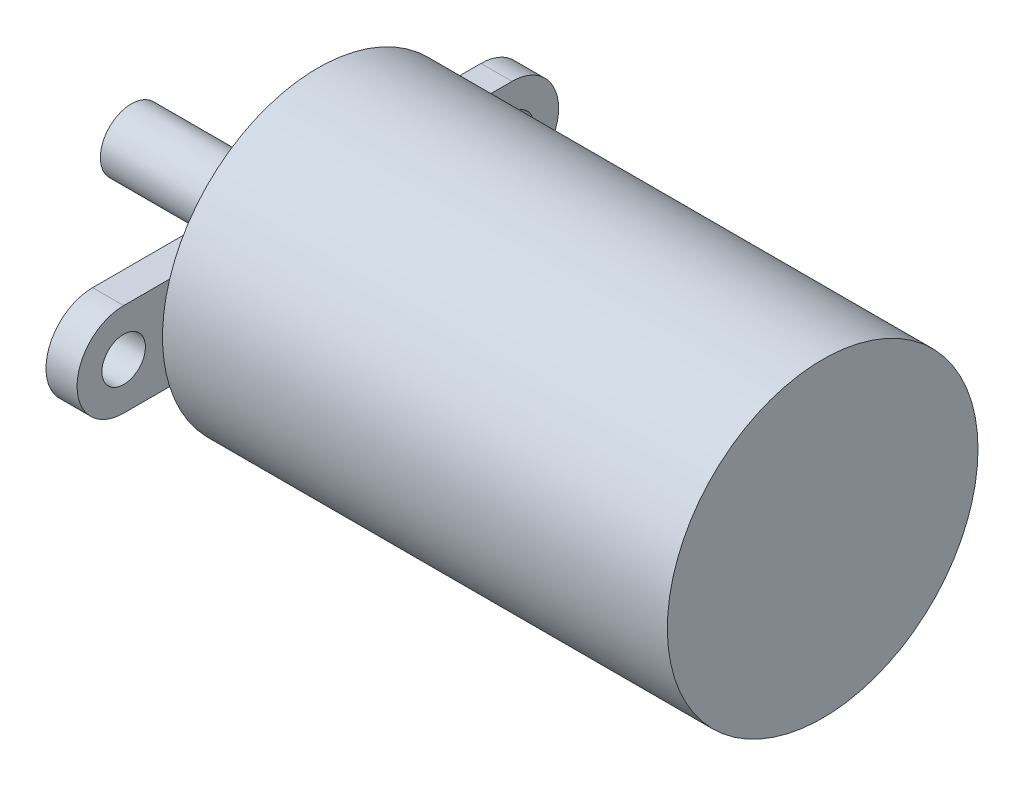
ISO-10303-21;
HEADER;
FILE_DESCRIPTION(('STEP AP214'),'2;1');
FILE_NAME('part.step','',(''),(''),'','','');
FILE_SCHEMA(('AUTOMOTIVE_DESIGN { 1 0 10303 214 1 1 1 1 }'));
ENDSEC;
DATA;
#1=APPLICATION_CONTEXT('core data for automotive mechanical design processes');
#2=APPLICATION_PROTOCOL_DEFINITION('international standard','automotive_design',2000,#1);
#3=PRODUCT_CONTEXT('',#1,'mechanical');
#4=PRODUCT('Part','Part','',(#3));
#5=PRODUCT_RELATED_PRODUCT_CATEGORY('part','',(#4));
#6=PRODUCT_DEFINITION_FORMATION('','',#4);
#7=PRODUCT_DEFINITION_CONTEXT('part definition',#1,'design');
#8=PRODUCT_DEFINITION('design','',#6,#7);
#9=PRODUCT_DEFINITION_SHAPE('','',#8);
#10=(LENGTH_UNIT() NAMED_UNIT(*) SI_UNIT(.MILLI.,.METRE.));
#11=(NAMED_UNIT(*) PLANE_ANGLE_UNIT() SI_UNIT($,.RADIAN.));
#12=(NAMED_UNIT(*) SI_UNIT($,.STERADIAN.) SOLID_ANGLE_UNIT());
#13=UNCERTAINTY_MEASURE_WITH_UNIT(LENGTH_MEASURE(1.E-05),#10,'distance_accuracy_value','');
#14=(GEOMETRIC_REPRESENTATION_CONTEXT(3) GLOBAL_UNCERTAINTY_ASSIGNED_CONTEXT((#13)) GLOBAL_UNIT_ASSIGNED_CONTEXT((#10,
#11,#12)) REPRESENTATION_CONTEXT('',''));
#15=CARTESIAN_POINT('',(0.,0.,0.));
#16=DIRECTION('',(0.,0.,1.));
#17=DIRECTION('',(1.,0.,0.));
#18=AXIS2_PLACEMENT_3D('',#15,#16,#17);
#19=CARTESIAN_POINT('',(-4.,0.,0.));
#20=DIRECTION('',(-1.,0.,0.));
#21=DIRECTION('',(0.,0.,1.));
#22=AXIS2_PLACEMENT_3D('',#19,#20,#21);
#23=PLANE('',#22);
#24=CARTESIAN_POINT('',(-4.,0.,0.));
#25=DIRECTION('',(-1.,0.,0.));
#26=DIRECTION('',(0.,0.,1.));
#27=AXIS2_PLACEMENT_3D('',#24,#25,#26);
#28=CIRCLE('',#27,4.);
#29=CARTESIAN_POINT('',(-4.,0.,4.));
#30=VERTEX_POINT('',#29);
#31=EDGE_CURVE('E124',#30,#30,#28,.T.);
#32=ORIENTED_EDGE('',*,*,#31,.T.);
#33=EDGE_LOOP('',(#32));
#34=FACE_BOUND('',#33,.T.);
#35=CARTESIAN_POINT('',(-4.,0.,0.));
#36=DIRECTION('',(-1.,0.,0.));
#37=DIRECTION('',(0.,0.,1.));
#38=AXIS2_PLACEMENT_3D('',#35,#36,#37);
#39=CIRCLE('',#38,2.);
#40=CARTESIAN_POINT('',(-4.,0.,2.));
#41=VERTEX_POINT('',#40);
#42=EDGE_CURVE('E377',#41,#41,#39,.T.);
#43=ORIENTED_EDGE('',*,*,#42,.F.);
#44=EDGE_LOOP('',(#43));
#45=FACE_BOUND('',#44,.T.);
#46=ADVANCED_FACE('F33',(#34,#45),#23,.T.);
#47=CARTESIAN_POINT('',(-2.,0.,-12.5));
#48=DIRECTION('',(-1.,0.,0.));
#49=DIRECTION('',(0.,0.,1.));
#50=AXIS2_PLACEMENT_3D('',#47,#48,#49);
#51=PLANE('',#50);
#52=CARTESIAN_POINT('',(-2.,0.,0.));
#53=DIRECTION('',(-1.,0.,0.));
#54=DIRECTION('',(0.,0.,1.));
#55=AXIS2_PLACEMENT_3D('',#52,#53,#54);
#56=CIRCLE('',#55,4.);
#57=CARTESIAN_POINT('',(-2.,3.00000000000001,-2.64575131106458));
#58=VERTEX_POINT('',#57);
#59=CARTESIAN_POINT('',(-2.,-3.,-2.64575131106459));
#60=VERTEX_POINT('',#59);
#61=EDGE_CURVE('E11',#58,#60,#56,.T.);
#62=ORIENTED_EDGE('',*,*,#61,.F.);
#63=DIRECTION('',(0.,0.,-1.));
#64=VECTOR('',#63,1.);
#65=CARTESIAN_POINT('',(-2.,3.00000000000001,-12.5));
#66=LINE('',#65,#64);
#67=CARTESIAN_POINT('',(-2.,3.00000000000001,-12.5));
#68=VERTEX_POINT('',#67);
#69=EDGE_CURVE('E109',#58,#68,#66,.T.);
#70=ORIENTED_EDGE('',*,*,#69,.T.);
#71=CARTESIAN_POINT('',(-2.,0.,-12.5));
#72=DIRECTION('',(-1.,0.,0.));
#73=DIRECTION('',(0.,0.,1.));
#74=AXIS2_PLACEMENT_3D('',#71,#72,#73);
#75=CIRCLE('',#74,3.00000000000001);
#76=CARTESIAN_POINT('',(-2.,-3.00000000000001,-12.5));
#77=VERTEX_POINT('',#76);
#78=EDGE_CURVE('E140',#68,#77,#75,.T.);
#79=ORIENTED_EDGE('',*,*,#78,.T.);
#80=DIRECTION('',(0.,0.,1.));
#81=VECTOR('',#80,1.);
#82=CARTESIAN_POINT('',(-2.,-3.00000000000001,-12.5));
#83=LINE('',#82,#81);
#84=EDGE_CURVE('E145',#77,#60,#83,.T.);
#85=ORIENTED_EDGE('',*,*,#84,.T.);
#86=EDGE_LOOP('',(#62,#70,#79,#85));
#87=FACE_BOUND('',#86,.T.);
#88=CARTESIAN_POINT('',(-2.,-0.140336266117075,-12.5));
#89=DIRECTION('',(-1.,0.,0.));
#90=DIRECTION('',(0.,0.,1.));
#91=AXIS2_PLACEMENT_3D('',#88,#89,#90);
#92=CIRCLE('',#91,1.39999999999999);
#93=CARTESIAN_POINT('',(-2.,-0.140336266117075,-11.1));
#94=VERTEX_POINT('',#93);
#95=EDGE_CURVE('E126',#94,#94,#92,.T.);
#96=ORIENTED_EDGE('',*,*,#95,.F.);
#97=EDGE_LOOP('',(#96));
#98=FACE_BOUND('',#97,.T.);
#99=ADVANCED_FACE('F221',(#87,#98),#51,.T.);
#100=CARTESIAN_POINT('',(0.,0.,0.));
#101=DIRECTION('',(1.,0.,0.));
#102=DIRECTION('',(0.,0.,-1.));
#103=AXIS2_PLACEMENT_3D('',#100,#101,#102);
#104=PLANE('',#103);
#105=DIRECTION('',(0.,0.,-1.));
#106=VECTOR('',#105,1.);
#107=CARTESIAN_POINT('',(0.,3.00000000000001,-12.5));
#108=LINE('',#107,#106);
#109=CARTESIAN_POINT('',(0.,3.00000000000001,9.53939201416946));
#110=VERTEX_POINT('',#109);
#111=CARTESIAN_POINT('',(0.,3.00000000000001,-9.53939201416946));
#112=VERTEX_POINT('',#111);
#113=EDGE_CURVE('E122',#110,#112,#108,.T.);
#114=ORIENTED_EDGE('',*,*,#113,.F.);
#115=CARTESIAN_POINT('',(0.,0.,0.));
#116=DIRECTION('',(1.,0.,0.));
#117=DIRECTION('',(0.,0.,-1.));
#118=AXIS2_PLACEMENT_3D('',#115,#116,#117);
#119=CIRCLE('',#118,10.);
#120=EDGE_CURVE('E173',#112,#110,#119,.T.);
#121=ORIENTED_EDGE('',*,*,#120,.F.);
#122=EDGE_LOOP('',(#114,#121));
#123=FACE_BOUND('',#122,.T.);
#124=ADVANCED_FACE('F227',(#123),#104,.F.);
#125=DIRECTION('',(0.,0.,1.));
#126=VECTOR('',#125,1.);
#127=CARTESIAN_POINT('',(0.,-3.00000000000001,-12.5));
#128=LINE('',#127,#126);
#129=CARTESIAN_POINT('',(0.,-3.,-9.53939201416946));
#130=VERTEX_POINT('',#129);
#131=CARTESIAN_POINT('',(0.,-3.,9.53939201416946));
#132=VERTEX_POINT('',#131);
#133=EDGE_CURVE('E156',#130,#132,#128,.T.);
#134=ORIENTED_EDGE('',*,*,#133,.F.);
#135=EDGE_CURVE('E179',#132,#130,#119,.T.);
#136=ORIENTED_EDGE('',*,*,#135,.F.);
#137=EDGE_LOOP('',(#134,#136));
#138=FACE_BOUND('',#137,.T.);
#139=ADVANCED_FACE('F257',(#138),#104,.F.);
#140=CARTESIAN_POINT('',(32.5,0.,0.));
#141=DIRECTION('',(-1.,0.,0.));
#142=DIRECTION('',(0.,0.,1.));
#143=AXIS2_PLACEMENT_3D('',#140,#141,#142);
#144=CYLINDRICAL_SURFACE('',#143,10.);
#145=CARTESIAN_POINT('',(32.5,0.,0.));
#146=DIRECTION('',(1.,0.,0.));
#147=DIRECTION('',(0.,0.,-1.));
#148=AXIS2_PLACEMENT_3D('',#145,#146,#147);
#149=CIRCLE('',#148,10.);
#150=CARTESIAN_POINT('',(32.5,0.,-10.));
#151=VERTEX_POINT('',#150);
#152=EDGE_CURVE('E171',#151,#151,#149,.T.);
#153=ORIENTED_EDGE('',*,*,#152,.F.);
#154=EDGE_LOOP('',(#153));
#155=FACE_BOUND('',#154,.T.);
#156=ORIENTED_EDGE('',*,*,#120,.T.);
#157=EDGE_CURVE('E175',#110,#132,#119,.T.);
#158=ORIENTED_EDGE('',*,*,#157,.T.);
#159=ORIENTED_EDGE('',*,*,#135,.T.);
#160=EDGE_CURVE('E170',#130,#112,#119,.T.);
#161=ORIENTED_EDGE('',*,*,#160,.T.);
#162=EDGE_LOOP('',(#156,#158,#159,#161));
#163=FACE_BOUND('',#162,.T.);
#164=ADVANCED_FACE('F35',(#155,#163),#144,.T.);
#165=CARTESIAN_POINT('',(32.5,0.,0.));
#166=DIRECTION('',(1.,0.,0.));
#167=DIRECTION('',(0.,0.,-1.));
#168=AXIS2_PLACEMENT_3D('',#165,#166,#167);
#169=PLANE('',#168);
#170=ORIENTED_EDGE('',*,*,#152,.T.);
#171=EDGE_LOOP('',(#170));
#172=FACE_BOUND('',#171,.T.);
#173=ADVANCED_FACE('F205',(#172),#169,.T.);
#174=CARTESIAN_POINT('',(0.,0.,-12.5));
#175=DIRECTION('',(-1.,0.,0.));
#176=DIRECTION('',(0.,0.,1.));
#177=AXIS2_PLACEMENT_3D('',#174,#175,#176);
#178=PLANE('',#177);
#179=CARTESIAN_POINT('',(0.,0.,12.5));
#180=DIRECTION('',(-1.,0.,0.));
#181=DIRECTION('',(0.,0.,1.));
#182=AXIS2_PLACEMENT_3D('',#179,#180,#181);
#183=CIRCLE('',#182,1.39999999999999);
#184=CARTESIAN_POINT('',(0.,0.,13.9));
#185=VERTEX_POINT('',#184);
#186=EDGE_CURVE('E136',#185,#185,#183,.T.);
#187=ORIENTED_EDGE('',*,*,#186,.T.);
#188=EDGE_LOOP('',(#187));
#189=FACE_BOUND('',#188,.T.);
#190=ORIENTED_EDGE('',*,*,#157,.F.);
#191=CARTESIAN_POINT('',(0.,3.00000000000001,12.5));
#192=VERTEX_POINT('',#191);
#193=EDGE_CURVE('E144',#192,#110,#108,.T.);
#194=ORIENTED_EDGE('',*,*,#193,.F.);
#195=CARTESIAN_POINT('',(0.,0.,12.5));
#196=DIRECTION('',(-1.,0.,0.));
#197=DIRECTION('',(0.,0.,1.));
#198=AXIS2_PLACEMENT_3D('',#195,#196,#197);
#199=CIRCLE('',#198,3.00000000000001);
#200=CARTESIAN_POINT('',(0.,-3.,12.5));
#201=VERTEX_POINT('',#200);
#202=EDGE_CURVE('E155',#201,#192,#199,.T.);
#203=ORIENTED_EDGE('',*,*,#202,.F.);
#204=EDGE_CURVE('E151',#132,#201,#128,.T.);
#205=ORIENTED_EDGE('',*,*,#204,.F.);
#206=EDGE_LOOP('',(#190,#194,#203,#205));
#207=FACE_BOUND('',#206,.T.);
#208=ADVANCED_FACE('F203',(#189,#207),#178,.F.);
#209=CARTESIAN_POINT('',(-2.,0.,-12.5));
#210=DIRECTION('',(1.,0.,0.));
#211=DIRECTION('',(0.,0.,-1.));
#212=AXIS2_PLACEMENT_3D('',#209,#210,#211);
#213=CYLINDRICAL_SURFACE('',#212,3.00000000000001);
#214=CARTESIAN_POINT('',(0.,0.,-12.5));
#215=DIRECTION('',(-1.,0.,0.));
#216=DIRECTION('',(0.,0.,1.));
#217=AXIS2_PLACEMENT_3D('',#214,#215,#216);
#218=CIRCLE('',#217,3.00000000000001);
#219=CARTESIAN_POINT('',(0.,3.00000000000001,-12.5));
#220=VERTEX_POINT('',#219);
#221=CARTESIAN_POINT('',(0.,-3.00000000000001,-12.5));
#222=VERTEX_POINT('',#221);
#223=EDGE_CURVE('E139',#220,#222,#218,.T.);
#224=ORIENTED_EDGE('',*,*,#223,.T.);
#225=DIRECTION('',(1.,0.,0.));
#226=VECTOR('',#225,1.);
#227=CARTESIAN_POINT('',(-2.,-3.00000000000001,-12.5));
#228=LINE('',#227,#226);
#229=EDGE_CURVE('E167',#77,#222,#228,.T.);
#230=ORIENTED_EDGE('',*,*,#229,.F.);
#231=ORIENTED_EDGE('',*,*,#78,.F.);
#232=DIRECTION('',(1.,0.,0.));
#233=VECTOR('',#232,1.);
#234=CARTESIAN_POINT('',(-2.,3.00000000000001,-12.5));
#235=LINE('',#234,#233);
#236=EDGE_CURVE('E106',#68,#220,#235,.T.);
#237=ORIENTED_EDGE('',*,*,#236,.T.);
#238=EDGE_LOOP('',(#224,#230,#231,#237));
#239=FACE_BOUND('',#238,.T.);
#240=ADVANCED_FACE('F196',(#239),#213,.T.);
#241=CARTESIAN_POINT('',(-2.,-3.00000000000001,-12.5));
#242=DIRECTION('',(0.,1.,0.));
#243=DIRECTION('',(0.,0.,1.));
#244=AXIS2_PLACEMENT_3D('',#241,#242,#243);
#245=PLANE('',#244);
#246=EDGE_CURVE('E152',#222,#130,#128,.T.);
#247=ORIENTED_EDGE('',*,*,#246,.T.);
#248=ORIENTED_EDGE('',*,*,#133,.T.);
#249=ORIENTED_EDGE('',*,*,#204,.T.);
#250=DIRECTION('',(1.,0.,0.));
#251=VECTOR('',#250,1.);
#252=CARTESIAN_POINT('',(-2.,-3.,12.5));
#253=LINE('',#252,#251);
#254=CARTESIAN_POINT('',(-2.,-3.,12.5));
#255=VERTEX_POINT('',#254);
#256=EDGE_CURVE('E164',#255,#201,#253,.T.);
#257=ORIENTED_EDGE('',*,*,#256,.F.);
#258=CARTESIAN_POINT('',(-2.,-3.,2.64575131106459));
#259=VERTEX_POINT('',#258);
#260=EDGE_CURVE('E143',#259,#255,#83,.T.);
#261=ORIENTED_EDGE('',*,*,#260,.F.);
#262=EDGE_CURVE('E147',#60,#259,#83,.T.);
#263=ORIENTED_EDGE('',*,*,#262,.F.);
#264=ORIENTED_EDGE('',*,*,#84,.F.);
#265=ORIENTED_EDGE('',*,*,#229,.T.);
#266=EDGE_LOOP('',(#247,#248,#249,#257,#261,#263,#264,#265));
#267=FACE_BOUND('',#266,.T.);
#268=ADVANCED_FACE('F192',(#267),#245,.F.);
#269=CARTESIAN_POINT('',(-2.,0.,12.5));
#270=DIRECTION('',(1.,0.,0.));
#271=DIRECTION('',(0.,0.,-1.));
#272=AXIS2_PLACEMENT_3D('',#269,#270,#271);
#273=CYLINDRICAL_SURFACE('',#272,3.00000000000001);
#274=ORIENTED_EDGE('',*,*,#202,.T.);
#275=DIRECTION('',(1.,0.,0.));
#276=VECTOR('',#275,1.);
#277=CARTESIAN_POINT('',(-2.,3.00000000000001,12.5));
#278=LINE('',#277,#276);
#279=CARTESIAN_POINT('',(-2.,3.00000000000001,12.5));
#280=VERTEX_POINT('',#279);
#281=EDGE_CURVE('E162',#280,#192,#278,.T.);
#282=ORIENTED_EDGE('',*,*,#281,.F.);
#283=CARTESIAN_POINT('',(-2.,0.,12.5));
#284=DIRECTION('',(-1.,0.,0.));
#285=DIRECTION('',(0.,0.,1.));
#286=AXIS2_PLACEMENT_3D('',#283,#284,#285);
#287=CIRCLE('',#286,3.00000000000001);
#288=EDGE_CURVE('E102',#255,#280,#287,.T.);
#289=ORIENTED_EDGE('',*,*,#288,.F.);
#290=ORIENTED_EDGE('',*,*,#256,.T.);
#291=EDGE_LOOP('',(#274,#282,#289,#290));
#292=FACE_BOUND('',#291,.T.);
#293=ADVANCED_FACE('F201',(#292),#273,.T.);
#294=CARTESIAN_POINT('',(-2.,3.00000000000001,-12.5));
#295=DIRECTION('',(0.,-1.,0.));
#296=DIRECTION('',(0.,0.,-1.));
#297=AXIS2_PLACEMENT_3D('',#294,#295,#296);
#298=PLANE('',#297);
#299=ORIENTED_EDGE('',*,*,#193,.T.);
#300=ORIENTED_EDGE('',*,*,#113,.T.);
#301=EDGE_CURVE('E158',#112,#220,#108,.T.);
#302=ORIENTED_EDGE('',*,*,#301,.T.);
#303=ORIENTED_EDGE('',*,*,#236,.F.);
#304=ORIENTED_EDGE('',*,*,#69,.F.);
#305=CARTESIAN_POINT('',(-2.,3.00000000000001,2.64575131106458));
#306=VERTEX_POINT('',#305);
#307=EDGE_CURVE('E107',#306,#58,#66,.T.);
#308=ORIENTED_EDGE('',*,*,#307,.F.);
#309=EDGE_CURVE('E97',#280,#306,#66,.T.);
#310=ORIENTED_EDGE('',*,*,#309,.F.);
#311=ORIENTED_EDGE('',*,*,#281,.T.);
#312=EDGE_LOOP('',(#299,#300,#302,#303,#304,#308,#310,#311));
#313=FACE_BOUND('',#312,.T.);
#314=ADVANCED_FACE('F112',(#313),#298,.F.);
#315=EDGE_CURVE('E42',#259,#306,#56,.T.);
#316=ORIENTED_EDGE('',*,*,#315,.F.);
#317=ORIENTED_EDGE('',*,*,#260,.T.);
#318=ORIENTED_EDGE('',*,*,#288,.T.);
#319=ORIENTED_EDGE('',*,*,#309,.T.);
#320=EDGE_LOOP('',(#316,#317,#318,#319));
#321=FACE_BOUND('',#320,.T.);
#322=CARTESIAN_POINT('',(-2.,0.,12.5));
#323=DIRECTION('',(-1.,0.,0.));
#324=DIRECTION('',(0.,0.,1.));
#325=AXIS2_PLACEMENT_3D('',#322,#323,#324);
#326=CIRCLE('',#325,1.39999999999999);
#327=CARTESIAN_POINT('',(-2.,0.,13.9));
#328=VERTEX_POINT('',#327);
#329=EDGE_CURVE('E133',#328,#328,#326,.T.);
#330=ORIENTED_EDGE('',*,*,#329,.F.);
#331=EDGE_LOOP('',(#330));
#332=FACE_BOUND('',#331,.T.);
#333=ADVANCED_FACE('F99',(#321,#332),#51,.T.);
#334=CARTESIAN_POINT('',(0.,-0.140336266117075,-12.5));
#335=DIRECTION('',(-1.,0.,0.));
#336=DIRECTION('',(0.,0.,1.));
#337=AXIS2_PLACEMENT_3D('',#334,#335,#336);
#338=CIRCLE('',#337,1.39999999999999);
#339=CARTESIAN_POINT('',(0.,-0.140336266117075,-11.1));
#340=VERTEX_POINT('',#339);
#341=EDGE_CURVE('E37',#340,#340,#338,.T.);
#342=ORIENTED_EDGE('',*,*,#341,.T.);
#343=EDGE_LOOP('',(#342));
#344=FACE_BOUND('',#343,.T.);
#345=ORIENTED_EDGE('',*,*,#160,.F.);
#346=ORIENTED_EDGE('',*,*,#246,.F.);
#347=ORIENTED_EDGE('',*,*,#223,.F.);
#348=ORIENTED_EDGE('',*,*,#301,.F.);
#349=EDGE_LOOP('',(#345,#346,#347,#348));
#350=FACE_BOUND('',#349,.T.);
#351=ADVANCED_FACE('F187',(#344,#350),#178,.F.);
#352=CARTESIAN_POINT('',(-2.,0.,12.5));
#353=DIRECTION('',(-1.,0.,0.));
#354=DIRECTION('',(0.,0.,1.));
#355=AXIS2_PLACEMENT_3D('',#352,#353,#354);
#356=CYLINDRICAL_SURFACE('',#355,1.39999999999999);
#357=ORIENTED_EDGE('',*,*,#329,.T.);
#358=EDGE_LOOP('',(#357));
#359=FACE_BOUND('',#358,.T.);
#360=ORIENTED_EDGE('',*,*,#186,.F.);
#361=EDGE_LOOP('',(#360));
#362=FACE_BOUND('',#361,.T.);
#363=ADVANCED_FACE('F218',(#359,#362),#356,.F.);
#364=CARTESIAN_POINT('',(-2.,-0.140336266117075,-12.5));
#365=DIRECTION('',(-1.,0.,0.));
#366=DIRECTION('',(0.,0.,1.));
#367=AXIS2_PLACEMENT_3D('',#364,#365,#366);
#368=CYLINDRICAL_SURFACE('',#367,1.39999999999999);
#369=ORIENTED_EDGE('',*,*,#95,.T.);
#370=EDGE_LOOP('',(#369));
#371=FACE_BOUND('',#370,.T.);
#372=ORIENTED_EDGE('',*,*,#341,.F.);
#373=EDGE_LOOP('',(#372));
#374=FACE_BOUND('',#373,.T.);
#375=ADVANCED_FACE('F236',(#371,#374),#368,.F.);
#376=CARTESIAN_POINT('',(-2.,0.,0.));
#377=DIRECTION('',(-1.,0.,0.));
#378=DIRECTION('',(0.,0.,1.));
#379=AXIS2_PLACEMENT_3D('',#376,#377,#378);
#380=PLANE('',#379);
#381=EDGE_CURVE('E44',#60,#259,#56,.T.);
#382=ORIENTED_EDGE('',*,*,#381,.F.);
#383=ORIENTED_EDGE('',*,*,#262,.T.);
#384=EDGE_LOOP('',(#382,#383));
#385=FACE_BOUND('',#384,.T.);
#386=ADVANCED_FACE('F233',(#385),#380,.F.);
#387=EDGE_CURVE('E120',#306,#58,#56,.T.);
#388=ORIENTED_EDGE('',*,*,#387,.F.);
#389=ORIENTED_EDGE('',*,*,#307,.T.);
#390=EDGE_LOOP('',(#388,#389));
#391=FACE_BOUND('',#390,.T.);
#392=ADVANCED_FACE('F123',(#391),#380,.F.);
#393=CARTESIAN_POINT('',(-4.,0.,0.));
#394=DIRECTION('',(1.,0.,0.));
#395=DIRECTION('',(0.,0.,-1.));
#396=AXIS2_PLACEMENT_3D('',#393,#394,#395);
#397=CYLINDRICAL_SURFACE('',#396,4.);
#398=ORIENTED_EDGE('',*,*,#31,.F.);
#399=EDGE_LOOP('',(#398));
#400=FACE_BOUND('',#399,.T.);
#401=ORIENTED_EDGE('',*,*,#387,.T.);
#402=ORIENTED_EDGE('',*,*,#61,.T.);
#403=ORIENTED_EDGE('',*,*,#381,.T.);
#404=ORIENTED_EDGE('',*,*,#315,.T.);
#405=EDGE_LOOP('',(#401,#402,#403,#404));
#406=FACE_BOUND('',#405,.T.);
#407=ADVANCED_FACE('F119',(#400,#406),#397,.T.);
#408=CARTESIAN_POINT('',(-12.,0.,0.));
#409=DIRECTION('',(1.,0.,0.));
#410=DIRECTION('',(0.,0.,-1.));
#411=AXIS2_PLACEMENT_3D('',#408,#409,#410);
#412=CYLINDRICAL_SURFACE('',#411,2.);
#413=CARTESIAN_POINT('',(-12.,0.,0.));
#414=DIRECTION('',(-1.,0.,0.));
#415=DIRECTION('',(0.,0.,1.));
#416=AXIS2_PLACEMENT_3D('',#413,#414,#415);
#417=CIRCLE('',#416,2.);
#418=CARTESIAN_POINT('',(-12.,0.,2.));
#419=VERTEX_POINT('',#418);
#420=EDGE_CURVE('E128',#419,#419,#417,.T.);
#421=ORIENTED_EDGE('',*,*,#420,.F.);
#422=EDGE_LOOP('',(#421));
#423=FACE_BOUND('',#422,.T.);
#424=ORIENTED_EDGE('',*,*,#42,.T.);
#425=EDGE_LOOP('',(#424));
#426=FACE_BOUND('',#425,.T.);
#427=ADVANCED_FACE('F231',(#423,#426),#412,.T.);
#428=CARTESIAN_POINT('',(-12.,0.,0.));
#429=DIRECTION('',(-1.,0.,0.));
#430=DIRECTION('',(0.,0.,1.));
#431=AXIS2_PLACEMENT_3D('',#428,#429,#430);
#432=PLANE('',#431);
#433=ORIENTED_EDGE('',*,*,#420,.T.);
#434=EDGE_LOOP('',(#433));
#435=FACE_BOUND('',#434,.T.);
#436=ADVANCED_FACE('F358',(#435),#432,.T.);
#437=CLOSED_SHELL('',(#46,#99,#124,#139,#164,#173,#208,#240,#268,#293,#314,#333,#351,#363,#375,
#386,#392,#407,#427,#436));
#438=MANIFOLD_SOLID_BREP('B2',#437);
#439=ADVANCED_BREP_SHAPE_REPRESENTATION('',(#18,#438),#14);
#440=SHAPE_DEFINITION_REPRESENTATION(#9,#439);
ENDSEC;
END-ISO-10303-21;
